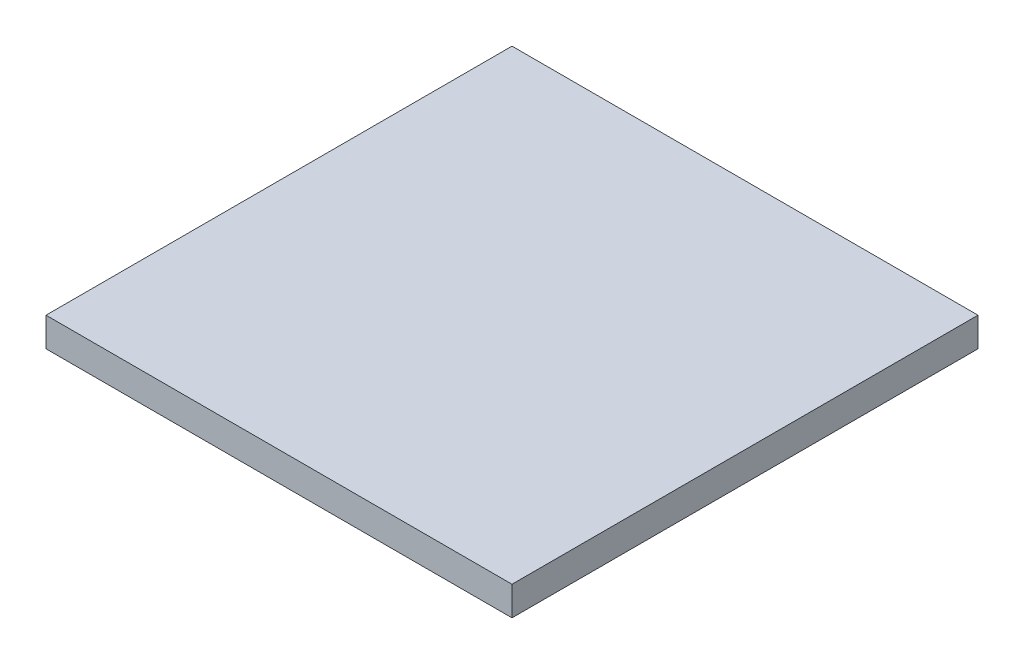
ISO-10303-21;
HEADER;
FILE_DESCRIPTION(('STEP AP214'),'2;1');
FILE_NAME('part.step','',(''),(''),'','','');
FILE_SCHEMA(('AUTOMOTIVE_DESIGN { 1 0 10303 214 1 1 1 1 }'));
ENDSEC;
DATA;
#1=APPLICATION_CONTEXT('core data for automotive mechanical design processes');
#2=APPLICATION_PROTOCOL_DEFINITION('international standard','automotive_design',2000,#1);
#3=PRODUCT_CONTEXT('',#1,'mechanical');
#4=PRODUCT('Part','Part','',(#3));
#5=PRODUCT_RELATED_PRODUCT_CATEGORY('part','',(#4));
#6=PRODUCT_DEFINITION_FORMATION('','',#4);
#7=PRODUCT_DEFINITION_CONTEXT('part definition',#1,'design');
#8=PRODUCT_DEFINITION('design','',#6,#7);
#9=PRODUCT_DEFINITION_SHAPE('','',#8);
#10=(LENGTH_UNIT() NAMED_UNIT(*) SI_UNIT(.MILLI.,.METRE.));
#11=(NAMED_UNIT(*) PLANE_ANGLE_UNIT() SI_UNIT($,.RADIAN.));
#12=(NAMED_UNIT(*) SI_UNIT($,.STERADIAN.) SOLID_ANGLE_UNIT());
#13=UNCERTAINTY_MEASURE_WITH_UNIT(LENGTH_MEASURE(1.E-05),#10,'distance_accuracy_value','');
#14=(GEOMETRIC_REPRESENTATION_CONTEXT(3) GLOBAL_UNCERTAINTY_ASSIGNED_CONTEXT((#13)) GLOBAL_UNIT_ASSIGNED_CONTEXT((#10,
#11,#12)) REPRESENTATION_CONTEXT('',''));
#15=CARTESIAN_POINT('',(0.,0.,0.));
#16=DIRECTION('',(0.,0.,1.));
#17=DIRECTION('',(1.,0.,0.));
#18=AXIS2_PLACEMENT_3D('',#15,#16,#17);
#19=CARTESIAN_POINT('',(0.,19.05,0.));
#20=DIRECTION('',(1.,0.,0.));
#21=DIRECTION('',(0.,0.,-1.));
#22=AXIS2_PLACEMENT_3D('',#19,#20,#21);
#23=PLANE('',#22);
#24=DIRECTION('',(0.,0.,1.));
#25=VECTOR('',#24,1.);
#26=CARTESIAN_POINT('',(0.,0.,0.));
#27=LINE('',#26,#25);
#28=CARTESIAN_POINT('',(0.,0.,-304.8));
#29=VERTEX_POINT('',#28);
#30=CARTESIAN_POINT('',(0.,0.,0.));
#31=VERTEX_POINT('',#30);
#32=EDGE_CURVE('E96',#29,#31,#27,.T.);
#33=ORIENTED_EDGE('',*,*,#32,.T.);
#34=DIRECTION('',(0.,-1.,0.));
#35=VECTOR('',#34,1.);
#36=CARTESIAN_POINT('',(0.,19.05,0.));
#37=LINE('',#36,#35);
#38=CARTESIAN_POINT('',(0.,19.05,0.));
#39=VERTEX_POINT('',#38);
#40=EDGE_CURVE('E11',#39,#31,#37,.T.);
#41=ORIENTED_EDGE('',*,*,#40,.F.);
#42=DIRECTION('',(0.,0.,1.));
#43=VECTOR('',#42,1.);
#44=CARTESIAN_POINT('',(0.,19.05,0.));
#45=LINE('',#44,#43);
#46=CARTESIAN_POINT('',(0.,19.05,-304.8));
#47=VERTEX_POINT('',#46);
#48=EDGE_CURVE('E84',#47,#39,#45,.T.);
#49=ORIENTED_EDGE('',*,*,#48,.F.);
#50=DIRECTION('',(0.,-1.,0.));
#51=VECTOR('',#50,1.);
#52=CARTESIAN_POINT('',(0.,19.05,-304.8));
#53=LINE('',#52,#51);
#54=EDGE_CURVE('E92',#47,#29,#53,.T.);
#55=ORIENTED_EDGE('',*,*,#54,.T.);
#56=EDGE_LOOP('',(#33,#41,#49,#55));
#57=FACE_BOUND('',#56,.T.);
#58=ADVANCED_FACE('F33',(#57),#23,.F.);
#59=CARTESIAN_POINT('',(0.,19.05,0.));
#60=DIRECTION('',(0.,0.,-1.));
#61=DIRECTION('',(-1.,0.,0.));
#62=AXIS2_PLACEMENT_3D('',#59,#60,#61);
#63=PLANE('',#62);
#64=DIRECTION('',(1.,0.,0.));
#65=VECTOR('',#64,1.);
#66=CARTESIAN_POINT('',(0.,0.,0.));
#67=LINE('',#66,#65);
#68=CARTESIAN_POINT('',(304.8,0.,0.));
#69=VERTEX_POINT('',#68);
#70=EDGE_CURVE('E88',#31,#69,#67,.T.);
#71=ORIENTED_EDGE('',*,*,#70,.T.);
#72=DIRECTION('',(0.,-1.,0.));
#73=VECTOR('',#72,1.);
#74=CARTESIAN_POINT('',(304.8,19.05,0.));
#75=LINE('',#74,#73);
#76=CARTESIAN_POINT('',(304.8,19.05,0.));
#77=VERTEX_POINT('',#76);
#78=EDGE_CURVE('E41',#77,#69,#75,.T.);
#79=ORIENTED_EDGE('',*,*,#78,.F.);
#80=DIRECTION('',(1.,0.,0.));
#81=VECTOR('',#80,1.);
#82=CARTESIAN_POINT('',(0.,19.05,0.));
#83=LINE('',#82,#81);
#84=EDGE_CURVE('E79',#39,#77,#83,.T.);
#85=ORIENTED_EDGE('',*,*,#84,.F.);
#86=ORIENTED_EDGE('',*,*,#40,.T.);
#87=EDGE_LOOP('',(#71,#79,#85,#86));
#88=FACE_BOUND('',#87,.T.);
#89=ADVANCED_FACE('F87',(#88),#63,.F.);
#90=CARTESIAN_POINT('',(304.8,19.05,0.));
#91=DIRECTION('',(-1.,0.,0.));
#92=DIRECTION('',(0.,0.,1.));
#93=AXIS2_PLACEMENT_3D('',#90,#91,#92);
#94=PLANE('',#93);
#95=DIRECTION('',(0.,0.,-1.));
#96=VECTOR('',#95,1.);
#97=CARTESIAN_POINT('',(304.8,0.,0.));
#98=LINE('',#97,#96);
#99=CARTESIAN_POINT('',(304.8,0.,-304.8));
#100=VERTEX_POINT('',#99);
#101=EDGE_CURVE('E66',#69,#100,#98,.T.);
#102=ORIENTED_EDGE('',*,*,#101,.T.);
#103=DIRECTION('',(0.,-1.,0.));
#104=VECTOR('',#103,1.);
#105=CARTESIAN_POINT('',(304.8,19.05,-304.8));
#106=LINE('',#105,#104);
#107=CARTESIAN_POINT('',(304.8,19.05,-304.8));
#108=VERTEX_POINT('',#107);
#109=EDGE_CURVE('E89',#108,#100,#106,.T.);
#110=ORIENTED_EDGE('',*,*,#109,.F.);
#111=DIRECTION('',(0.,0.,-1.));
#112=VECTOR('',#111,1.);
#113=CARTESIAN_POINT('',(304.8,19.05,0.));
#114=LINE('',#113,#112);
#115=EDGE_CURVE('E82',#77,#108,#114,.T.);
#116=ORIENTED_EDGE('',*,*,#115,.F.);
#117=ORIENTED_EDGE('',*,*,#78,.T.);
#118=EDGE_LOOP('',(#102,#110,#116,#117));
#119=FACE_BOUND('',#118,.T.);
#120=ADVANCED_FACE('F90',(#119),#94,.F.);
#121=CARTESIAN_POINT('',(0.,19.05,-304.8));
#122=DIRECTION('',(0.,0.,1.));
#123=DIRECTION('',(1.,0.,0.));
#124=AXIS2_PLACEMENT_3D('',#121,#122,#123);
#125=PLANE('',#124);
#126=DIRECTION('',(-1.,0.,0.));
#127=VECTOR('',#126,1.);
#128=CARTESIAN_POINT('',(0.,0.,-304.8));
#129=LINE('',#128,#127);
#130=EDGE_CURVE('E72',#100,#29,#129,.T.);
#131=ORIENTED_EDGE('',*,*,#130,.T.);
#132=ORIENTED_EDGE('',*,*,#54,.F.);
#133=DIRECTION('',(-1.,0.,0.));
#134=VECTOR('',#133,1.);
#135=CARTESIAN_POINT('',(0.,19.05,-304.8));
#136=LINE('',#135,#134);
#137=EDGE_CURVE('E49',#108,#47,#136,.T.);
#138=ORIENTED_EDGE('',*,*,#137,.F.);
#139=ORIENTED_EDGE('',*,*,#109,.T.);
#140=EDGE_LOOP('',(#131,#132,#138,#139));
#141=FACE_BOUND('',#140,.T.);
#142=ADVANCED_FACE('F103',(#141),#125,.F.);
#143=CARTESIAN_POINT('',(0.,19.05,0.));
#144=DIRECTION('',(0.,-1.,0.));
#145=DIRECTION('',(0.,0.,-1.));
#146=AXIS2_PLACEMENT_3D('',#143,#144,#145);
#147=PLANE('',#146);
#148=ORIENTED_EDGE('',*,*,#48,.T.);
#149=ORIENTED_EDGE('',*,*,#84,.T.);
#150=ORIENTED_EDGE('',*,*,#115,.T.);
#151=ORIENTED_EDGE('',*,*,#137,.T.);
#152=EDGE_LOOP('',(#148,#149,#150,#151));
#153=FACE_BOUND('',#152,.T.);
#154=ADVANCED_FACE('F80',(#153),#147,.F.);
#155=CARTESIAN_POINT('',(0.,0.,0.));
#156=DIRECTION('',(0.,-1.,0.));
#157=DIRECTION('',(0.,0.,-1.));
#158=AXIS2_PLACEMENT_3D('',#155,#156,#157);
#159=PLANE('',#158);
#160=ORIENTED_EDGE('',*,*,#32,.F.);
#161=ORIENTED_EDGE('',*,*,#130,.F.);
#162=ORIENTED_EDGE('',*,*,#101,.F.);
#163=ORIENTED_EDGE('',*,*,#70,.F.);
#164=EDGE_LOOP('',(#160,#161,#162,#163));
#165=FACE_BOUND('',#164,.T.);
#166=ADVANCED_FACE('F106',(#165),#159,.T.);
#167=CLOSED_SHELL('',(#58,#89,#120,#142,#154,#166));
#168=MANIFOLD_SOLID_BREP('B2',#167);
#169=ADVANCED_BREP_SHAPE_REPRESENTATION('',(#18,#168),#14);
#170=SHAPE_DEFINITION_REPRESENTATION(#9,#169);
ENDSEC;
END-ISO-10303-21;
